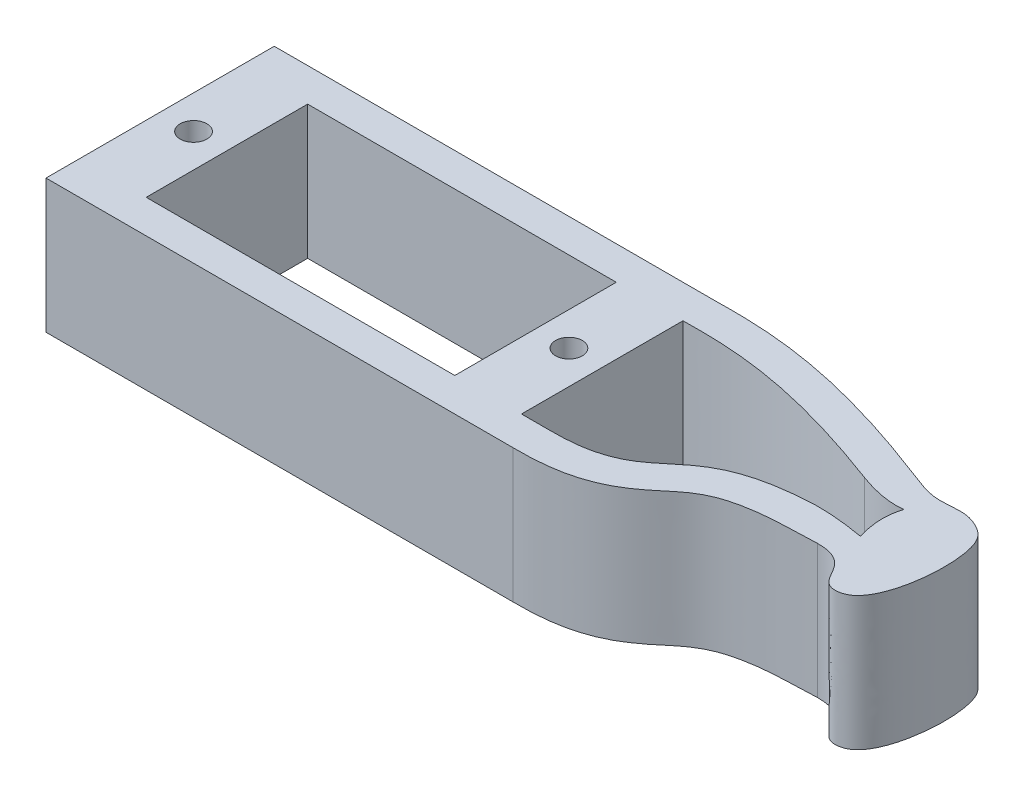
ISO-10303-21;
HEADER;
FILE_DESCRIPTION(('STEP AP214'),'2;1');
FILE_NAME('part.step','',(''),(''),'','','');
FILE_SCHEMA(('AUTOMOTIVE_DESIGN { 1 0 10303 214 1 1 1 1 }'));
ENDSEC;
DATA;
#1=APPLICATION_CONTEXT('core data for automotive mechanical design processes');
#2=APPLICATION_PROTOCOL_DEFINITION('international standard','automotive_design',2000,#1);
#3=PRODUCT_CONTEXT('',#1,'mechanical');
#4=PRODUCT('Part','Part','',(#3));
#5=PRODUCT_RELATED_PRODUCT_CATEGORY('part','',(#4));
#6=PRODUCT_DEFINITION_FORMATION('','',#4);
#7=PRODUCT_DEFINITION_CONTEXT('part definition',#1,'design');
#8=PRODUCT_DEFINITION('design','',#6,#7);
#9=PRODUCT_DEFINITION_SHAPE('','',#8);
#10=(LENGTH_UNIT() NAMED_UNIT(*) SI_UNIT(.MILLI.,.METRE.));
#11=(NAMED_UNIT(*) PLANE_ANGLE_UNIT() SI_UNIT($,.RADIAN.));
#12=(NAMED_UNIT(*) SI_UNIT($,.STERADIAN.) SOLID_ANGLE_UNIT());
#13=UNCERTAINTY_MEASURE_WITH_UNIT(LENGTH_MEASURE(1.E-05),#10,'distance_accuracy_value','');
#14=(GEOMETRIC_REPRESENTATION_CONTEXT(3) GLOBAL_UNCERTAINTY_ASSIGNED_CONTEXT((#13)) GLOBAL_UNIT_ASSIGNED_CONTEXT((#10,
#11,#12)) REPRESENTATION_CONTEXT('',''));
#15=CARTESIAN_POINT('',(0.,0.,0.));
#16=DIRECTION('',(0.,0.,1.));
#17=DIRECTION('',(1.,0.,0.));
#18=AXIS2_PLACEMENT_3D('',#15,#16,#17);
#19=CARTESIAN_POINT('',(38.866856063161,10.,11.3671407197963));
#20=DIRECTION('',(0.,1.,0.));
#21=DIRECTION('',(0.,0.,1.));
#22=AXIS2_PLACEMENT_3D('',#19,#20,#21);
#23=PLANE('',#22);
#24=CARTESIAN_POINT('',(-2.5,10.,6.04258256770856));
#25=DIRECTION('',(0.,1.,0.));
#26=DIRECTION('',(0.,0.,1.));
#27=AXIS2_PLACEMENT_3D('',#24,#25,#26);
#28=CIRCLE('',#27,1.);
#29=CARTESIAN_POINT('',(-2.5,10.,7.04258256770856));
#30=VERTEX_POINT('',#29);
#31=EDGE_CURVE('E608',#30,#30,#28,.T.);
#32=ORIENTED_EDGE('',*,*,#31,.F.);
#33=EDGE_LOOP('',(#32));
#34=FACE_BOUND('',#33,.T.);
#35=DIRECTION('',(-1.,0.,0.));
#36=VECTOR('',#35,1.);
#37=CARTESIAN_POINT('',(-2.5,10.,-2.5));
#38=LINE('',#37,#36);
#39=CARTESIAN_POINT('',(28.070995288117,10.,-2.5));
#40=VERTEX_POINT('',#39);
#41=CARTESIAN_POINT('',(-5.,10.,-2.5));
#42=VERTEX_POINT('',#41);
#43=EDGE_CURVE('E303',#40,#42,#38,.T.);
#44=ORIENTED_EDGE('',*,*,#43,.T.);
#45=DIRECTION('',(0.,0.,1.));
#46=VECTOR('',#45,1.);
#47=CARTESIAN_POINT('',(-5.,10.,-2.5));
#48=LINE('',#47,#46);
#49=CARTESIAN_POINT('',(-5.,10.,14.5851651354171));
#50=VERTEX_POINT('',#49);
#51=EDGE_CURVE('E329',#42,#50,#48,.T.);
#52=ORIENTED_EDGE('',*,*,#51,.T.);
#53=DIRECTION('',(1.,0.,0.));
#54=VECTOR('',#53,1.);
#55=CARTESIAN_POINT('',(-5.,10.,14.5851651354171));
#56=LINE('',#55,#54);
#57=CARTESIAN_POINT('',(29.9653226309514,10.,14.5851651354171));
#58=VERTEX_POINT('',#57);
#59=EDGE_CURVE('E327',#50,#58,#56,.T.);
#60=ORIENTED_EDGE('',*,*,#59,.T.);
#61=CARTESIAN_POINT('',(29.9653226309514,10.,14.5851651354171));
#62=CARTESIAN_POINT('',(30.2668833563867,10.,14.5898357500036));
#63=CARTESIAN_POINT('',(30.8847993932556,10.,14.5871634127323));
#64=CARTESIAN_POINT('',(32.0030622844559,10.,14.5316925353354));
#65=CARTESIAN_POINT('',(33.2811269243152,10.,14.370482550396));
#66=CARTESIAN_POINT('',(34.6306273579348,10.,14.0302012832418));
#67=CARTESIAN_POINT('',(36.2077787560436,10.,13.3956332601621));
#68=CARTESIAN_POINT('',(37.7107836885223,10.,12.3641523123226));
#69=CARTESIAN_POINT('',(38.9005842184664,10.,11.3107949181522));
#70=CARTESIAN_POINT('',(39.8880158165781,10.,10.5955123338464));
#71=CARTESIAN_POINT('',(40.9997202200975,10.,10.0913370400385));
#72=CARTESIAN_POINT('',(42.3958211156878,10.,9.74989797390779));
#73=CARTESIAN_POINT('',(43.5205567033827,10.,9.58887360688736));
#74=CARTESIAN_POINT('',(44.475367740813,10.,9.51415898751658));
#75=CARTESIAN_POINT('',(45.0509948291004,10.,9.48549730480388));
#76=CARTESIAN_POINT('',(45.7237401045998,10.,9.46123199927853));
#77=CARTESIAN_POINT('',(46.555372490214,10.,9.42886966982337));
#78=CARTESIAN_POINT('',(47.2235124432799,10.,9.40359868551212));
#79=CARTESIAN_POINT('',(47.557228164241,10.,9.39088583344988));
#80=B_SPLINE_CURVE_WITH_KNOTS('',3,(#61,#62,#63,#64,#65,#66,#67,#68,#69,#70,#71,#72,#73,#74,#75,
#76,#77,#78,#79),.UNSPECIFIED.,.F.,.F.,(4,1,1,1,1,1,1,1,1,1,1,1,1,1,1,1,4),
(0.000757075448015065,0.0345176505249425,0.0682782256018699,0.135799375755725,0.20332052590958,
0.270841676063435,0.405883976371145,0.540926276678854,0.675968576986564,0.811010877294274,
0.878532027448129,0.946053177601984,0.979813752678911,0.996694040217375,1.01357432775584,
1.04733490283277,1.08109547790969),.UNSPECIFIED.);
#81=CARTESIAN_POINT('',(47.557228164241,10.,9.39088583344988));
#82=VERTEX_POINT('',#81);
#83=EDGE_CURVE('E349',#58,#82,#80,.T.);
#84=ORIENTED_EDGE('',*,*,#83,.T.);
#85=CARTESIAN_POINT('',(47.557228164241,10.,9.39088583344988));
#86=CARTESIAN_POINT('',(50.2446120958962,10.,9.35727304528843));
#87=CARTESIAN_POINT('',(49.6149107489341,10.,12.0219621910214));
#88=CARTESIAN_POINT('',(53.8106331794863,10.,11.5109371008119));
#89=CARTESIAN_POINT('',(54.3502018436602,10.,3.71524579387331));
#90=CARTESIAN_POINT('',(50.7905552456439,10.,1.17583070517761));
#91=CARTESIAN_POINT('',(49.8399959501129,10.,2.57848633737034));
#92=CARTESIAN_POINT('',(47.557228164241,10.,1.6341251114046));
#93=B_SPLINE_CURVE_WITH_KNOTS('',3,(#85,#86,#87,#88,#89,#90,#91,#92),.UNSPECIFIED.,.F.,.F.,(4,1,
1,1,1,4),(0.,0.206124452316591,0.260502327976179,0.512303597860358,0.589400880936293,1.),.UNSPECIFIED.);
#94=CARTESIAN_POINT('',(47.557228164241,10.,1.6341251114046));
#95=VERTEX_POINT('',#94);
#96=EDGE_CURVE('E260',#82,#95,#93,.T.);
#97=ORIENTED_EDGE('',*,*,#96,.T.);
#98=CARTESIAN_POINT('',(47.557228164241,10.,1.6341251114046));
#99=CARTESIAN_POINT('',(46.3856638823738,10.,1.19574857386112));
#100=CARTESIAN_POINT('',(43.9533969383482,10.,0.279779405527691));
#101=CARTESIAN_POINT('',(40.7938756495151,10.,-0.734966306684224));
#102=CARTESIAN_POINT('',(37.9973626381524,10.,-1.48587386732508));
#103=CARTESIAN_POINT('',(34.7071159792565,10.,-2.16873147415008));
#104=CARTESIAN_POINT('',(31.9642252839365,10.,-2.45751719053389));
#105=CARTESIAN_POINT('',(29.9218666157721,10.,-2.51211922864548));
#106=CARTESIAN_POINT('',(28.8355626574832,10.,-2.51124596502211));
#107=CARTESIAN_POINT('',(28.3288734396236,10.,-2.50431808469216));
#108=CARTESIAN_POINT('',(28.070995288117,10.,-2.5));
#109=B_SPLINE_CURVE_WITH_KNOTS('',3,(#98,#99,#100,#101,#102,#103,#104,#105,#106,#107,#108),
.UNSPECIFIED.,.F.,.F.,(4,1,1,1,1,1,1,1,4),(0.143669129094372,0.257224140802001,0.37077915250963,
0.484334164217259,0.597889175924887,0.824999199340145,0.938554211047774,0.995331716901588,
1.0521092227554),.UNSPECIFIED.);
#110=EDGE_CURVE('E252',#95,#40,#109,.T.);
#111=ORIENTED_EDGE('',*,*,#110,.T.);
#112=EDGE_LOOP('',(#44,#52,#60,#84,#97,#111));
#113=FACE_BOUND('',#112,.T.);
#114=DIRECTION('',(0.,0.,1.));
#115=VECTOR('',#114,1.);
#116=CARTESIAN_POINT('',(0.,10.,0.));
#117=LINE('',#116,#115);
#118=CARTESIAN_POINT('',(0.,10.,0.));
#119=VERTEX_POINT('',#118);
#120=CARTESIAN_POINT('',(0.,10.,12.0851651354171));
#121=VERTEX_POINT('',#120);
#122=EDGE_CURVE('E669',#119,#121,#117,.T.);
#123=ORIENTED_EDGE('',*,*,#122,.F.);
#124=DIRECTION('',(-1.,0.,0.));
#125=VECTOR('',#124,1.);
#126=CARTESIAN_POINT('',(0.,10.,0.));
#127=LINE('',#126,#125);
#128=CARTESIAN_POINT('',(23.1,10.,0.));
#129=VERTEX_POINT('',#128);
#130=EDGE_CURVE('E666',#129,#119,#127,.T.);
#131=ORIENTED_EDGE('',*,*,#130,.F.);
#132=DIRECTION('',(0.,0.,-1.));
#133=VECTOR('',#132,1.);
#134=CARTESIAN_POINT('',(23.1,10.,12.0851651354171));
#135=LINE('',#134,#133);
#136=CARTESIAN_POINT('',(23.1,10.,12.0851651354171));
#137=VERTEX_POINT('',#136);
#138=EDGE_CURVE('E677',#137,#129,#135,.T.);
#139=ORIENTED_EDGE('',*,*,#138,.F.);
#140=DIRECTION('',(1.,0.,0.));
#141=VECTOR('',#140,1.);
#142=CARTESIAN_POINT('',(0.,10.,12.0851651354171));
#143=LINE('',#142,#141);
#144=EDGE_CURVE('E673',#121,#137,#143,.T.);
#145=ORIENTED_EDGE('',*,*,#144,.F.);
#146=EDGE_LOOP('',(#123,#131,#139,#145));
#147=FACE_BOUND('',#146,.T.);
#148=CARTESIAN_POINT('',(45.057228164241,10.,6.98430960657603));
#149=CARTESIAN_POINT('',(46.596168679815,10.,6.96066102325324));
#150=CARTESIAN_POINT('',(48.7103270151303,10.,7.32576645158645));
#151=B_SPLINE_CURVE_WITH_KNOTS('',2,(#148,#149,#150),.UNSPECIFIED.,.F.,.F.,(3,3),(0.,1.),.UNSPECIFIED.);
#152=CARTESIAN_POINT('',(45.057228164241,10.,6.98430960657603));
#153=VERTEX_POINT('',#152);
#154=CARTESIAN_POINT('',(48.7103270151303,10.,7.32576645158645));
#155=VERTEX_POINT('',#154);
#156=EDGE_CURVE('E172',#153,#155,#151,.T.);
#157=ORIENTED_EDGE('',*,*,#156,.F.);
#158=CARTESIAN_POINT('',(29.9852161632243,10.,12.0851651354171));
#159=CARTESIAN_POINT('',(38.2810747079521,10.,12.2209443605822));
#160=CARTESIAN_POINT('',(35.1724522029101,10.,7.36086871533734));
#161=CARTESIAN_POINT('',(45.057228164241,10.,6.98430960657603));
#162=B_SPLINE_CURVE_WITH_KNOTS('',3,(#158,#159,#160,#161),.UNSPECIFIED.,.F.,.F.,(4,4),(0.,1.),.UNSPECIFIED.);
#163=CARTESIAN_POINT('',(29.9852161632243,10.,12.0851651354171));
#164=VERTEX_POINT('',#163);
#165=EDGE_CURVE('E163',#164,#153,#162,.T.);
#166=ORIENTED_EDGE('',*,*,#165,.F.);
#167=DIRECTION('',(1.,0.,0.));
#168=VECTOR('',#167,1.);
#169=CARTESIAN_POINT('',(28.0920322760738,10.,12.0851651354171));
#170=LINE('',#169,#168);
#171=CARTESIAN_POINT('',(28.0920322760738,10.,12.0851651354171));
#172=VERTEX_POINT('',#171);
#173=EDGE_CURVE('E601',#172,#164,#170,.T.);
#174=ORIENTED_EDGE('',*,*,#173,.F.);
#175=DIRECTION('',(0.,0.,1.));
#176=VECTOR('',#175,1.);
#177=CARTESIAN_POINT('',(28.0920322760738,10.,0.));
#178=LINE('',#177,#176);
#179=CARTESIAN_POINT('',(28.0920322760738,10.,0.));
#180=VERTEX_POINT('',#179);
#181=EDGE_CURVE('E592',#180,#172,#178,.T.);
#182=ORIENTED_EDGE('',*,*,#181,.F.);
#183=CARTESIAN_POINT('',(45.0572281642411,10.,3.36795631708854));
#184=CARTESIAN_POINT('',(36.1453920604466,10.,0.0333208089882172));
#185=CARTESIAN_POINT('',(31.8190342239397,10.,-0.0630491739583388));
#186=CARTESIAN_POINT('',(28.0920322760738,10.,0.));
#187=B_SPLINE_CURVE_WITH_KNOTS('',3,(#183,#184,#185,#186),.UNSPECIFIED.,.F.,.F.,(4,4),
(0.142072163734168,1.),.UNSPECIFIED.);
#188=CARTESIAN_POINT('',(45.0572281642411,10.,3.36795631708854));
#189=VERTEX_POINT('',#188);
#190=EDGE_CURVE('E587',#189,#180,#187,.T.);
#191=ORIENTED_EDGE('',*,*,#190,.F.);
#192=CARTESIAN_POINT('',(48.5973126252053,10.,3.96311649777559));
#193=CARTESIAN_POINT('',(47.1810751517544,10.,4.141830425743));
#194=CARTESIAN_POINT('',(45.057228164241,10.,3.36795631708853));
#195=B_SPLINE_CURVE_WITH_KNOTS('',2,(#192,#193,#194),.UNSPECIFIED.,.F.,.F.,(3,3),(0.,1.),.UNSPECIFIED.);
#196=CARTESIAN_POINT('',(48.5973126252053,10.,3.96311649777559));
#197=VERTEX_POINT('',#196);
#198=EDGE_CURVE('E193',#197,#189,#195,.T.);
#199=ORIENTED_EDGE('',*,*,#198,.F.);
#200=CARTESIAN_POINT('',(48.7103270151303,10.,7.32576645158645));
#201=CARTESIAN_POINT('',(48.3452536132831,10.,6.19757171358135));
#202=CARTESIAN_POINT('',(48.2430866216302,10.,5.00954180630637));
#203=CARTESIAN_POINT('',(48.5973126252053,10.,3.96311649777559));
#204=B_SPLINE_CURVE_WITH_KNOTS('',3,(#200,#201,#202,#203),.UNSPECIFIED.,.F.,.F.,(4,4),(0.,1.),.UNSPECIFIED.);
#205=EDGE_CURVE('E187',#155,#197,#204,.T.);
#206=ORIENTED_EDGE('',*,*,#205,.F.);
#207=EDGE_LOOP('',(#157,#166,#174,#182,#191,#199,#206));
#208=FACE_BOUND('',#207,.T.);
#209=CARTESIAN_POINT('',(25.6000010172625,10.,6.04254892676587));
#210=DIRECTION('',(0.,1.,0.));
#211=DIRECTION('',(0.,0.,1.));
#212=AXIS2_PLACEMENT_3D('',#209,#210,#211);
#213=CIRCLE('',#212,1.);
#214=CARTESIAN_POINT('',(25.6000010172625,10.,7.04254892676587));
#215=VERTEX_POINT('',#214);
#216=EDGE_CURVE('E720',#215,#215,#213,.T.);
#217=ORIENTED_EDGE('',*,*,#216,.F.);
#218=EDGE_LOOP('',(#217));
#219=FACE_BOUND('',#218,.T.);
#220=ADVANCED_FACE('F43',(#34,#113,#147,#208,#219),#23,.T.);
#221=CARTESIAN_POINT('',(38.866856063161,0.,11.3671407197963));
#222=DIRECTION('',(0.,1.,0.));
#223=DIRECTION('',(0.,0.,1.));
#224=AXIS2_PLACEMENT_3D('',#221,#222,#223);
#225=PLANE('',#224);
#226=DIRECTION('',(-1.,0.,0.));
#227=VECTOR('',#226,1.);
#228=CARTESIAN_POINT('',(0.,0.,0.));
#229=LINE('',#228,#227);
#230=CARTESIAN_POINT('',(23.1,0.,0.));
#231=VERTEX_POINT('',#230);
#232=CARTESIAN_POINT('',(0.,0.,0.));
#233=VERTEX_POINT('',#232);
#234=EDGE_CURVE('E181',#231,#233,#229,.T.);
#235=ORIENTED_EDGE('',*,*,#234,.T.);
#236=DIRECTION('',(0.,0.,1.));
#237=VECTOR('',#236,1.);
#238=CARTESIAN_POINT('',(0.,0.,0.));
#239=LINE('',#238,#237);
#240=CARTESIAN_POINT('',(0.,0.,12.0851651354171));
#241=VERTEX_POINT('',#240);
#242=EDGE_CURVE('E684',#233,#241,#239,.T.);
#243=ORIENTED_EDGE('',*,*,#242,.T.);
#244=DIRECTION('',(1.,0.,0.));
#245=VECTOR('',#244,1.);
#246=CARTESIAN_POINT('',(0.,0.,12.0851651354171));
#247=LINE('',#246,#245);
#248=CARTESIAN_POINT('',(23.1,0.,12.0851651354171));
#249=VERTEX_POINT('',#248);
#250=EDGE_CURVE('E688',#241,#249,#247,.T.);
#251=ORIENTED_EDGE('',*,*,#250,.T.);
#252=DIRECTION('',(0.,0.,-1.));
#253=VECTOR('',#252,1.);
#254=CARTESIAN_POINT('',(23.1,0.,12.0851651354171));
#255=LINE('',#254,#253);
#256=EDGE_CURVE('E670',#249,#231,#255,.T.);
#257=ORIENTED_EDGE('',*,*,#256,.T.);
#258=EDGE_LOOP('',(#235,#243,#251,#257));
#259=FACE_BOUND('',#258,.T.);
#260=DIRECTION('',(0.,0.,1.));
#261=VECTOR('',#260,1.);
#262=CARTESIAN_POINT('',(-5.,0.,-2.5));
#263=LINE('',#262,#261);
#264=CARTESIAN_POINT('',(-5.,0.,-2.5));
#265=VERTEX_POINT('',#264);
#266=CARTESIAN_POINT('',(-5.,0.,14.5851651354171));
#267=VERTEX_POINT('',#266);
#268=EDGE_CURVE('E265',#265,#267,#263,.T.);
#269=ORIENTED_EDGE('',*,*,#268,.F.);
#270=DIRECTION('',(-1.,0.,0.));
#271=VECTOR('',#270,1.);
#272=CARTESIAN_POINT('',(-2.5,0.,-2.5));
#273=LINE('',#272,#271);
#274=CARTESIAN_POINT('',(28.070995288117,0.,-2.5));
#275=VERTEX_POINT('',#274);
#276=EDGE_CURVE('E297',#275,#265,#273,.T.);
#277=ORIENTED_EDGE('',*,*,#276,.F.);
#278=CARTESIAN_POINT('',(47.557228164241,0.,1.6341251114046));
#279=CARTESIAN_POINT('',(46.3856638823738,0.,1.19574857386112));
#280=CARTESIAN_POINT('',(43.9533969383482,0.,0.279779405527691));
#281=CARTESIAN_POINT('',(40.7938756495151,0.,-0.734966306684224));
#282=CARTESIAN_POINT('',(37.9973626381524,0.,-1.48587386732508));
#283=CARTESIAN_POINT('',(34.7071159792565,0.,-2.16873147415008));
#284=CARTESIAN_POINT('',(31.9642252839365,0.,-2.45751719053389));
#285=CARTESIAN_POINT('',(29.9218666157721,0.,-2.51211922864548));
#286=CARTESIAN_POINT('',(28.8355626574832,0.,-2.51124596502211));
#287=CARTESIAN_POINT('',(28.3288734396236,0.,-2.50431808469216));
#288=CARTESIAN_POINT('',(28.070995288117,0.,-2.5));
#289=B_SPLINE_CURVE_WITH_KNOTS('',3,(#278,#279,#280,#281,#282,#283,#284,#285,#286,#287,#288),
.UNSPECIFIED.,.F.,.F.,(4,1,1,1,1,1,1,1,4),(0.143669129094372,0.257224140802001,0.37077915250963,
0.484334164217259,0.597889175924887,0.824999199340145,0.938554211047774,0.995331716901588,
1.0521092227554),.UNSPECIFIED.);
#290=CARTESIAN_POINT('',(47.557228164241,0.,1.6341251114046));
#291=VERTEX_POINT('',#290);
#292=EDGE_CURVE('E289',#291,#275,#289,.T.);
#293=ORIENTED_EDGE('',*,*,#292,.F.);
#294=CARTESIAN_POINT('',(47.557228164241,0.,9.39088583344988));
#295=CARTESIAN_POINT('',(50.2446120958962,0.,9.35727304528843));
#296=CARTESIAN_POINT('',(49.6149107489341,0.,12.0219621910214));
#297=CARTESIAN_POINT('',(53.8106331794863,0.,11.5109371008119));
#298=CARTESIAN_POINT('',(54.3502018436602,0.,3.71524579387331));
#299=CARTESIAN_POINT('',(50.7905552456439,0.,1.17583070517761));
#300=CARTESIAN_POINT('',(49.8399959501129,0.,2.57848633737034));
#301=CARTESIAN_POINT('',(47.557228164241,0.,1.6341251114046));
#302=B_SPLINE_CURVE_WITH_KNOTS('',3,(#294,#295,#296,#297,#298,#299,#300,#301),.UNSPECIFIED.,.F.,
.F.,(4,1,1,1,1,4),(0.,0.206124452316591,0.260502327976179,0.512303597860358,0.589400880936293,
1.),.UNSPECIFIED.);
#303=CARTESIAN_POINT('',(47.557228164241,0.,9.39088583344988));
#304=VERTEX_POINT('',#303);
#305=EDGE_CURVE('E281',#304,#291,#302,.T.);
#306=ORIENTED_EDGE('',*,*,#305,.F.);
#307=CARTESIAN_POINT('',(29.9653226309514,0.,14.5851651354171));
#308=CARTESIAN_POINT('',(30.2668833563867,0.,14.5898357500036));
#309=CARTESIAN_POINT('',(30.8847993932556,0.,14.5871634127323));
#310=CARTESIAN_POINT('',(32.0030622844559,0.,14.5316925353354));
#311=CARTESIAN_POINT('',(33.2811269243152,0.,14.370482550396));
#312=CARTESIAN_POINT('',(34.6306273579348,0.,14.0302012832418));
#313=CARTESIAN_POINT('',(36.2077787560436,0.,13.3956332601621));
#314=CARTESIAN_POINT('',(37.7107836885223,0.,12.3641523123226));
#315=CARTESIAN_POINT('',(38.9005842184664,0.,11.3107949181522));
#316=CARTESIAN_POINT('',(39.8880158165781,0.,10.5955123338464));
#317=CARTESIAN_POINT('',(40.9997202200975,0.,10.0913370400385));
#318=CARTESIAN_POINT('',(42.3958211156878,0.,9.74989797390779));
#319=CARTESIAN_POINT('',(43.5205567033827,0.,9.58887360688736));
#320=CARTESIAN_POINT('',(44.475367740813,0.,9.51415898751658));
#321=CARTESIAN_POINT('',(45.0509948291004,0.,9.48549730480388));
#322=CARTESIAN_POINT('',(45.7237401045998,0.,9.46123199927853));
#323=CARTESIAN_POINT('',(46.555372490214,0.,9.42886966982337));
#324=CARTESIAN_POINT('',(47.2235124432799,0.,9.40359868551212));
#325=CARTESIAN_POINT('',(47.557228164241,0.,9.39088583344988));
#326=B_SPLINE_CURVE_WITH_KNOTS('',3,(#307,#308,#309,#310,#311,#312,#313,#314,#315,#316,#317,
#318,#319,#320,#321,#322,#323,#324,#325),.UNSPECIFIED.,.F.,.F.,(4,1,1,1,1,1,1,1,1,1,1,1,1,1,1,1,
4),(0.000757075448015065,0.0345176505249425,0.0682782256018699,0.135799375755725,
0.20332052590958,0.270841676063435,0.405883976371145,0.540926276678854,0.675968576986564,
0.811010877294274,0.878532027448129,0.946053177601984,0.979813752678911,0.996694040217375,
1.01357432775584,1.04733490283277,1.08109547790969),.UNSPECIFIED.);
#327=CARTESIAN_POINT('',(29.9653226309514,0.,14.5851651354171));
#328=VERTEX_POINT('',#327);
#329=EDGE_CURVE('E276',#328,#304,#326,.T.);
#330=ORIENTED_EDGE('',*,*,#329,.F.);
#331=DIRECTION('',(1.,0.,0.));
#332=VECTOR('',#331,1.);
#333=CARTESIAN_POINT('',(-2.5,0.,14.5851651354171));
#334=LINE('',#333,#332);
#335=EDGE_CURVE('E272',#267,#328,#334,.T.);
#336=ORIENTED_EDGE('',*,*,#335,.F.);
#337=EDGE_LOOP('',(#269,#277,#293,#306,#330,#336));
#338=FACE_BOUND('',#337,.T.);
#339=CARTESIAN_POINT('',(29.9852161632243,0.,12.0851651354171));
#340=CARTESIAN_POINT('',(38.2810747079521,0.,12.2209443605822));
#341=CARTESIAN_POINT('',(35.1724522029101,0.,7.36086871533734));
#342=CARTESIAN_POINT('',(45.057228164241,0.,6.98430960657603));
#343=B_SPLINE_CURVE_WITH_KNOTS('',3,(#339,#340,#341,#342),.UNSPECIFIED.,.F.,.F.,(4,4),(0.,1.),.UNSPECIFIED.);
#344=CARTESIAN_POINT('',(29.9852161632243,0.,12.0851651354171));
#345=VERTEX_POINT('',#344);
#346=CARTESIAN_POINT('',(45.057228164241,0.,6.98430960657603));
#347=VERTEX_POINT('',#346);
#348=EDGE_CURVE('E67',#345,#347,#343,.T.);
#349=ORIENTED_EDGE('',*,*,#348,.T.);
#350=CARTESIAN_POINT('',(45.057228164241,0.,6.98430960657603));
#351=CARTESIAN_POINT('',(46.596168679815,0.,6.96066102325324));
#352=CARTESIAN_POINT('',(48.7103270151303,0.,7.32576645158645));
#353=B_SPLINE_CURVE_WITH_KNOTS('',2,(#350,#351,#352),.UNSPECIFIED.,.F.,.F.,(3,3),(0.,1.),.UNSPECIFIED.);
#354=CARTESIAN_POINT('',(48.7103270151303,0.,7.32576645158645));
#355=VERTEX_POINT('',#354);
#356=EDGE_CURVE('E179',#347,#355,#353,.T.);
#357=ORIENTED_EDGE('',*,*,#356,.T.);
#358=CARTESIAN_POINT('',(48.7103270151303,0.,7.32576645158645));
#359=CARTESIAN_POINT('',(48.3452536132831,0.,6.19757171358135));
#360=CARTESIAN_POINT('',(48.2430866216302,0.,5.00954180630637));
#361=CARTESIAN_POINT('',(48.5973126252053,0.,3.96311649777559));
#362=B_SPLINE_CURVE_WITH_KNOTS('',3,(#358,#359,#360,#361),.UNSPECIFIED.,.F.,.F.,(4,4),(0.,1.),.UNSPECIFIED.);
#363=CARTESIAN_POINT('',(48.5973126252053,0.,3.96311649777559));
#364=VERTEX_POINT('',#363);
#365=EDGE_CURVE('E616',#355,#364,#362,.T.);
#366=ORIENTED_EDGE('',*,*,#365,.T.);
#367=CARTESIAN_POINT('',(48.5973126252053,0.,3.96311649777559));
#368=CARTESIAN_POINT('',(47.1810751517544,0.,4.141830425743));
#369=CARTESIAN_POINT('',(45.057228164241,0.,3.36795631708853));
#370=B_SPLINE_CURVE_WITH_KNOTS('',2,(#367,#368,#369),.UNSPECIFIED.,.F.,.F.,(3,3),(0.,1.),.UNSPECIFIED.);
#371=CARTESIAN_POINT('',(45.0572281642411,0.,3.36795631708854));
#372=VERTEX_POINT('',#371);
#373=EDGE_CURVE('E625',#364,#372,#370,.T.);
#374=ORIENTED_EDGE('',*,*,#373,.T.);
#375=CARTESIAN_POINT('',(45.0572281642411,0.,3.36795631708854));
#376=CARTESIAN_POINT('',(36.1453920604466,0.,0.0333208089882172));
#377=CARTESIAN_POINT('',(31.8190342239397,0.,-0.0630491739583388));
#378=CARTESIAN_POINT('',(28.0920322760738,0.,0.));
#379=B_SPLINE_CURVE_WITH_KNOTS('',3,(#375,#376,#377,#378),.UNSPECIFIED.,.F.,.F.,(4,4),
(0.142072163734168,1.),.UNSPECIFIED.);
#380=CARTESIAN_POINT('',(28.0920322760738,0.,0.));
#381=VERTEX_POINT('',#380);
#382=EDGE_CURVE('E633',#372,#381,#379,.T.);
#383=ORIENTED_EDGE('',*,*,#382,.T.);
#384=DIRECTION('',(0.,0.,1.));
#385=VECTOR('',#384,1.);
#386=CARTESIAN_POINT('',(28.0920322760738,0.,0.));
#387=LINE('',#386,#385);
#388=CARTESIAN_POINT('',(28.0920322760738,0.,12.0851651354171));
#389=VERTEX_POINT('',#388);
#390=EDGE_CURVE('E642',#381,#389,#387,.T.);
#391=ORIENTED_EDGE('',*,*,#390,.T.);
#392=DIRECTION('',(1.,0.,0.));
#393=VECTOR('',#392,1.);
#394=CARTESIAN_POINT('',(28.0920322760738,0.,12.0851651354171));
#395=LINE('',#394,#393);
#396=EDGE_CURVE('E173',#389,#345,#395,.T.);
#397=ORIENTED_EDGE('',*,*,#396,.T.);
#398=EDGE_LOOP('',(#349,#357,#366,#374,#383,#391,#397));
#399=FACE_BOUND('',#398,.T.);
#400=CARTESIAN_POINT('',(-2.5,0.,6.04258256770856));
#401=DIRECTION('',(0.,1.,0.));
#402=DIRECTION('',(0.,0.,1.));
#403=AXIS2_PLACEMENT_3D('',#400,#401,#402);
#404=CIRCLE('',#403,1.);
#405=CARTESIAN_POINT('',(-2.5,0.,7.04258256770856));
#406=VERTEX_POINT('',#405);
#407=EDGE_CURVE('E721',#406,#406,#404,.T.);
#408=ORIENTED_EDGE('',*,*,#407,.T.);
#409=EDGE_LOOP('',(#408));
#410=FACE_BOUND('',#409,.T.);
#411=CARTESIAN_POINT('',(25.6000010172625,0.,6.04254892676587));
#412=DIRECTION('',(0.,1.,0.));
#413=DIRECTION('',(0.,0.,1.));
#414=AXIS2_PLACEMENT_3D('',#411,#412,#413);
#415=CIRCLE('',#414,1.);
#416=CARTESIAN_POINT('',(25.6000010172625,0.,7.04254892676587));
#417=VERTEX_POINT('',#416);
#418=EDGE_CURVE('E722',#417,#417,#415,.T.);
#419=ORIENTED_EDGE('',*,*,#418,.T.);
#420=EDGE_LOOP('',(#419));
#421=FACE_BOUND('',#420,.T.);
#422=ADVANCED_FACE('F236',(#259,#338,#399,#410,#421),#225,.F.);
#423=CARTESIAN_POINT('',(-5.,10.,-2.5));
#424=DIRECTION('',(1.,0.,0.));
#425=DIRECTION('',(0.,0.,-1.));
#426=AXIS2_PLACEMENT_3D('',#423,#424,#425);
#427=PLANE('',#426);
#428=ORIENTED_EDGE('',*,*,#268,.T.);
#429=DIRECTION('',(0.,-1.,0.));
#430=VECTOR('',#429,1.);
#431=CARTESIAN_POINT('',(-5.,10.,14.5851651354171));
#432=LINE('',#431,#430);
#433=EDGE_CURVE('E52',#50,#267,#432,.T.);
#434=ORIENTED_EDGE('',*,*,#433,.F.);
#435=ORIENTED_EDGE('',*,*,#51,.F.);
#436=DIRECTION('',(0.,-1.,0.));
#437=VECTOR('',#436,1.);
#438=CARTESIAN_POINT('',(-5.,10.,-2.5));
#439=LINE('',#438,#437);
#440=EDGE_CURVE('E11',#42,#265,#439,.T.);
#441=ORIENTED_EDGE('',*,*,#440,.T.);
#442=EDGE_LOOP('',(#428,#434,#435,#441));
#443=FACE_BOUND('',#442,.T.);
#444=ADVANCED_FACE('F45',(#443),#427,.F.);
#445=CARTESIAN_POINT('',(-2.5,10.,14.5851651354171));
#446=DIRECTION('',(0.,0.,-1.));
#447=DIRECTION('',(-1.,0.,0.));
#448=AXIS2_PLACEMENT_3D('',#445,#446,#447);
#449=PLANE('',#448);
#450=ORIENTED_EDGE('',*,*,#335,.T.);
#451=DIRECTION('',(0.,-1.,0.));
#452=VECTOR('',#451,1.);
#453=CARTESIAN_POINT('',(29.9653226309514,10.,14.5851651354171));
#454=LINE('',#453,#452);
#455=EDGE_CURVE('E315',#58,#328,#454,.T.);
#456=ORIENTED_EDGE('',*,*,#455,.F.);
#457=ORIENTED_EDGE('',*,*,#59,.F.);
#458=ORIENTED_EDGE('',*,*,#433,.T.);
#459=EDGE_LOOP('',(#450,#456,#457,#458));
#460=FACE_BOUND('',#459,.T.);
#461=ADVANCED_FACE('F325',(#460),#449,.F.);
#462=DIRECTION('',(0.,-1.,0.));
#463=VECTOR('',#462,1.);
#464=SURFACE_OF_LINEAR_EXTRUSION('',#80,#463);
#465=ORIENTED_EDGE('',*,*,#329,.T.);
#466=DIRECTION('',(0.,-1.,0.));
#467=VECTOR('',#466,1.);
#468=CARTESIAN_POINT('',(47.557228164241,10.,9.39088583344988));
#469=LINE('',#468,#467);
#470=EDGE_CURVE('E311',#82,#304,#469,.T.);
#471=ORIENTED_EDGE('',*,*,#470,.F.);
#472=ORIENTED_EDGE('',*,*,#83,.F.);
#473=ORIENTED_EDGE('',*,*,#455,.T.);
#474=EDGE_LOOP('',(#465,#471,#472,#473));
#475=FACE_BOUND('',#474,.T.);
#476=ADVANCED_FACE('F341',(#475),#464,.F.);
#477=DIRECTION('',(0.,-1.,0.));
#478=VECTOR('',#477,1.);
#479=SURFACE_OF_LINEAR_EXTRUSION('',#93,#478);
#480=ORIENTED_EDGE('',*,*,#305,.T.);
#481=DIRECTION('',(0.,-1.,0.));
#482=VECTOR('',#481,1.);
#483=CARTESIAN_POINT('',(47.557228164241,10.,1.6341251114046));
#484=LINE('',#483,#482);
#485=EDGE_CURVE('E307',#95,#291,#484,.T.);
#486=ORIENTED_EDGE('',*,*,#485,.F.);
#487=ORIENTED_EDGE('',*,*,#96,.F.);
#488=ORIENTED_EDGE('',*,*,#470,.T.);
#489=EDGE_LOOP('',(#480,#486,#487,#488));
#490=FACE_BOUND('',#489,.T.);
#491=ADVANCED_FACE('F248',(#490),#479,.F.);
#492=DIRECTION('',(0.,-1.,0.));
#493=VECTOR('',#492,1.);
#494=SURFACE_OF_LINEAR_EXTRUSION('',#109,#493);
#495=ORIENTED_EDGE('',*,*,#292,.T.);
#496=DIRECTION('',(0.,-1.,0.));
#497=VECTOR('',#496,1.);
#498=CARTESIAN_POINT('',(28.070995288117,10.,-2.5));
#499=LINE('',#498,#497);
#500=EDGE_CURVE('E259',#40,#275,#499,.T.);
#501=ORIENTED_EDGE('',*,*,#500,.F.);
#502=ORIENTED_EDGE('',*,*,#110,.F.);
#503=ORIENTED_EDGE('',*,*,#485,.T.);
#504=EDGE_LOOP('',(#495,#501,#502,#503));
#505=FACE_BOUND('',#504,.T.);
#506=ADVANCED_FACE('F243',(#505),#494,.F.);
#507=CARTESIAN_POINT('',(-2.5,10.,-2.5));
#508=DIRECTION('',(0.,0.,1.));
#509=DIRECTION('',(1.,0.,0.));
#510=AXIS2_PLACEMENT_3D('',#507,#508,#509);
#511=PLANE('',#510);
#512=ORIENTED_EDGE('',*,*,#276,.T.);
#513=ORIENTED_EDGE('',*,*,#440,.F.);
#514=ORIENTED_EDGE('',*,*,#43,.F.);
#515=ORIENTED_EDGE('',*,*,#500,.T.);
#516=EDGE_LOOP('',(#512,#513,#514,#515));
#517=FACE_BOUND('',#516,.T.);
#518=ADVANCED_FACE('F232',(#517),#511,.F.);
#519=CARTESIAN_POINT('',(0.,10.,0.));
#520=DIRECTION('',(0.,0.,1.));
#521=DIRECTION('',(1.,0.,0.));
#522=AXIS2_PLACEMENT_3D('',#519,#520,#521);
#523=PLANE('',#522);
#524=ORIENTED_EDGE('',*,*,#234,.F.);
#525=DIRECTION('',(0.,-1.,0.));
#526=VECTOR('',#525,1.);
#527=CARTESIAN_POINT('',(23.1,10.,0.));
#528=LINE('',#527,#526);
#529=EDGE_CURVE('E680',#129,#231,#528,.T.);
#530=ORIENTED_EDGE('',*,*,#529,.F.);
#531=ORIENTED_EDGE('',*,*,#130,.T.);
#532=DIRECTION('',(0.,-1.,0.));
#533=VECTOR('',#532,1.);
#534=CARTESIAN_POINT('',(0.,10.,0.));
#535=LINE('',#534,#533);
#536=EDGE_CURVE('E273',#119,#233,#535,.T.);
#537=ORIENTED_EDGE('',*,*,#536,.T.);
#538=EDGE_LOOP('',(#524,#530,#531,#537));
#539=FACE_BOUND('',#538,.T.);
#540=ADVANCED_FACE('F228',(#539),#523,.T.);
#541=CARTESIAN_POINT('',(0.,10.,0.));
#542=DIRECTION('',(1.,0.,0.));
#543=DIRECTION('',(0.,0.,-1.));
#544=AXIS2_PLACEMENT_3D('',#541,#542,#543);
#545=PLANE('',#544);
#546=ORIENTED_EDGE('',*,*,#242,.F.);
#547=ORIENTED_EDGE('',*,*,#536,.F.);
#548=ORIENTED_EDGE('',*,*,#122,.T.);
#549=DIRECTION('',(0.,-1.,0.));
#550=VECTOR('',#549,1.);
#551=CARTESIAN_POINT('',(0.,10.,12.0851651354171));
#552=LINE('',#551,#550);
#553=EDGE_CURVE('E700',#121,#241,#552,.T.);
#554=ORIENTED_EDGE('',*,*,#553,.T.);
#555=EDGE_LOOP('',(#546,#547,#548,#554));
#556=FACE_BOUND('',#555,.T.);
#557=ADVANCED_FACE('F224',(#556),#545,.T.);
#558=CARTESIAN_POINT('',(0.,10.,12.0851651354171));
#559=DIRECTION('',(0.,0.,-1.));
#560=DIRECTION('',(-1.,0.,0.));
#561=AXIS2_PLACEMENT_3D('',#558,#559,#560);
#562=PLANE('',#561);
#563=ORIENTED_EDGE('',*,*,#250,.F.);
#564=ORIENTED_EDGE('',*,*,#553,.F.);
#565=ORIENTED_EDGE('',*,*,#144,.T.);
#566=DIRECTION('',(0.,-1.,0.));
#567=VECTOR('',#566,1.);
#568=CARTESIAN_POINT('',(23.1,10.,12.0851651354171));
#569=LINE('',#568,#567);
#570=EDGE_CURVE('E697',#137,#249,#569,.T.);
#571=ORIENTED_EDGE('',*,*,#570,.T.);
#572=EDGE_LOOP('',(#563,#564,#565,#571));
#573=FACE_BOUND('',#572,.T.);
#574=ADVANCED_FACE('F220',(#573),#562,.T.);
#575=CARTESIAN_POINT('',(23.1,10.,12.0851651354171));
#576=DIRECTION('',(-1.,0.,0.));
#577=DIRECTION('',(0.,0.,1.));
#578=AXIS2_PLACEMENT_3D('',#575,#576,#577);
#579=PLANE('',#578);
#580=ORIENTED_EDGE('',*,*,#256,.F.);
#581=ORIENTED_EDGE('',*,*,#570,.F.);
#582=ORIENTED_EDGE('',*,*,#138,.T.);
#583=ORIENTED_EDGE('',*,*,#529,.T.);
#584=EDGE_LOOP('',(#580,#581,#582,#583));
#585=FACE_BOUND('',#584,.T.);
#586=ADVANCED_FACE('F217',(#585),#579,.T.);
#587=DIRECTION('',(0.,-1.,0.));
#588=VECTOR('',#587,1.);
#589=SURFACE_OF_LINEAR_EXTRUSION('',#162,#588);
#590=ORIENTED_EDGE('',*,*,#348,.F.);
#591=DIRECTION('',(0.,-1.,0.));
#592=VECTOR('',#591,1.);
#593=CARTESIAN_POINT('',(29.9852161632243,10.,12.0851651354171));
#594=LINE('',#593,#592);
#595=EDGE_CURVE('E167',#164,#345,#594,.T.);
#596=ORIENTED_EDGE('',*,*,#595,.F.);
#597=ORIENTED_EDGE('',*,*,#165,.T.);
#598=DIRECTION('',(0.,-1.,0.));
#599=VECTOR('',#598,1.);
#600=CARTESIAN_POINT('',(45.057228164241,10.,6.98430960657603));
#601=LINE('',#600,#599);
#602=EDGE_CURVE('E166',#153,#347,#601,.T.);
#603=ORIENTED_EDGE('',*,*,#602,.T.);
#604=EDGE_LOOP('',(#590,#596,#597,#603));
#605=FACE_BOUND('',#604,.T.);
#606=ADVANCED_FACE('F165',(#605),#589,.T.);
#607=DIRECTION('',(0.,-1.,0.));
#608=VECTOR('',#607,1.);
#609=SURFACE_OF_LINEAR_EXTRUSION('',#151,#608);
#610=ORIENTED_EDGE('',*,*,#356,.F.);
#611=ORIENTED_EDGE('',*,*,#602,.F.);
#612=ORIENTED_EDGE('',*,*,#156,.T.);
#613=DIRECTION('',(0.,-1.,0.));
#614=VECTOR('',#613,1.);
#615=CARTESIAN_POINT('',(48.7103270151303,10.,7.32576645158645));
#616=LINE('',#615,#614);
#617=EDGE_CURVE('E182',#155,#355,#616,.T.);
#618=ORIENTED_EDGE('',*,*,#617,.T.);
#619=EDGE_LOOP('',(#610,#611,#612,#618));
#620=FACE_BOUND('',#619,.T.);
#621=ADVANCED_FACE('F176',(#620),#609,.T.);
#622=DIRECTION('',(0.,-1.,0.));
#623=VECTOR('',#622,1.);
#624=SURFACE_OF_LINEAR_EXTRUSION('',#204,#623);
#625=ORIENTED_EDGE('',*,*,#365,.F.);
#626=ORIENTED_EDGE('',*,*,#617,.F.);
#627=ORIENTED_EDGE('',*,*,#205,.T.);
#628=DIRECTION('',(0.,-1.,0.));
#629=VECTOR('',#628,1.);
#630=CARTESIAN_POINT('',(48.5973126252053,10.,3.96311649777559));
#631=LINE('',#630,#629);
#632=EDGE_CURVE('E662',#197,#364,#631,.T.);
#633=ORIENTED_EDGE('',*,*,#632,.T.);
#634=EDGE_LOOP('',(#625,#626,#627,#633));
#635=FACE_BOUND('',#634,.T.);
#636=ADVANCED_FACE('F213',(#635),#624,.T.);
#637=DIRECTION('',(0.,-1.,0.));
#638=VECTOR('',#637,1.);
#639=SURFACE_OF_LINEAR_EXTRUSION('',#195,#638);
#640=ORIENTED_EDGE('',*,*,#373,.F.);
#641=ORIENTED_EDGE('',*,*,#632,.F.);
#642=ORIENTED_EDGE('',*,*,#198,.T.);
#643=DIRECTION('',(0.,-1.,0.));
#644=VECTOR('',#643,1.);
#645=CARTESIAN_POINT('',(45.0572281642411,10.,3.36795631708854));
#646=LINE('',#645,#644);
#647=EDGE_CURVE('E659',#189,#372,#646,.T.);
#648=ORIENTED_EDGE('',*,*,#647,.T.);
#649=EDGE_LOOP('',(#640,#641,#642,#648));
#650=FACE_BOUND('',#649,.T.);
#651=ADVANCED_FACE('F473',(#650),#639,.T.);
#652=DIRECTION('',(0.,-1.,0.));
#653=VECTOR('',#652,1.);
#654=SURFACE_OF_LINEAR_EXTRUSION('',#187,#653);
#655=ORIENTED_EDGE('',*,*,#382,.F.);
#656=ORIENTED_EDGE('',*,*,#647,.F.);
#657=ORIENTED_EDGE('',*,*,#190,.T.);
#658=DIRECTION('',(0.,-1.,0.));
#659=VECTOR('',#658,1.);
#660=CARTESIAN_POINT('',(28.0920322760738,10.,0.));
#661=LINE('',#660,#659);
#662=EDGE_CURVE('E656',#180,#381,#661,.T.);
#663=ORIENTED_EDGE('',*,*,#662,.T.);
#664=EDGE_LOOP('',(#655,#656,#657,#663));
#665=FACE_BOUND('',#664,.T.);
#666=ADVANCED_FACE('F483',(#665),#654,.T.);
#667=CARTESIAN_POINT('',(28.0920322760738,10.,0.));
#668=DIRECTION('',(1.,0.,0.));
#669=DIRECTION('',(0.,0.,-1.));
#670=AXIS2_PLACEMENT_3D('',#667,#668,#669);
#671=PLANE('',#670);
#672=ORIENTED_EDGE('',*,*,#390,.F.);
#673=ORIENTED_EDGE('',*,*,#662,.F.);
#674=ORIENTED_EDGE('',*,*,#181,.T.);
#675=DIRECTION('',(0.,-1.,0.));
#676=VECTOR('',#675,1.);
#677=CARTESIAN_POINT('',(28.0920322760738,10.,12.0851651354171));
#678=LINE('',#677,#676);
#679=EDGE_CURVE('E59',#172,#389,#678,.T.);
#680=ORIENTED_EDGE('',*,*,#679,.T.);
#681=EDGE_LOOP('',(#672,#673,#674,#680));
#682=FACE_BOUND('',#681,.T.);
#683=ADVANCED_FACE('F493',(#682),#671,.T.);
#684=CARTESIAN_POINT('',(28.0920322760738,10.,12.0851651354171));
#685=DIRECTION('',(0.,0.,-1.));
#686=DIRECTION('',(-1.,0.,0.));
#687=AXIS2_PLACEMENT_3D('',#684,#685,#686);
#688=PLANE('',#687);
#689=ORIENTED_EDGE('',*,*,#396,.F.);
#690=ORIENTED_EDGE('',*,*,#679,.F.);
#691=ORIENTED_EDGE('',*,*,#173,.T.);
#692=ORIENTED_EDGE('',*,*,#595,.T.);
#693=EDGE_LOOP('',(#689,#690,#691,#692));
#694=FACE_BOUND('',#693,.T.);
#695=ADVANCED_FACE('F504',(#694),#688,.T.);
#696=CARTESIAN_POINT('',(-2.5,10.,6.04258256770856));
#697=DIRECTION('',(0.,-1.,0.));
#698=DIRECTION('',(0.,0.,-1.));
#699=AXIS2_PLACEMENT_3D('',#696,#697,#698);
#700=CYLINDRICAL_SURFACE('',#699,1.);
#701=ORIENTED_EDGE('',*,*,#31,.T.);
#702=EDGE_LOOP('',(#701));
#703=FACE_BOUND('',#702,.T.);
#704=ORIENTED_EDGE('',*,*,#407,.F.);
#705=EDGE_LOOP('',(#704));
#706=FACE_BOUND('',#705,.T.);
#707=ADVANCED_FACE('F515',(#703,#706),#700,.F.);
#708=CARTESIAN_POINT('',(25.6000010172625,10.,6.04254892676587));
#709=DIRECTION('',(0.,-1.,0.));
#710=DIRECTION('',(0.,0.,-1.));
#711=AXIS2_PLACEMENT_3D('',#708,#709,#710);
#712=CYLINDRICAL_SURFACE('',#711,1.);
#713=ORIENTED_EDGE('',*,*,#216,.T.);
#714=EDGE_LOOP('',(#713));
#715=FACE_BOUND('',#714,.T.);
#716=ORIENTED_EDGE('',*,*,#418,.F.);
#717=EDGE_LOOP('',(#716));
#718=FACE_BOUND('',#717,.T.);
#719=ADVANCED_FACE('F525',(#715,#718),#712,.F.);
#720=CLOSED_SHELL('',(#220,#422,#444,#461,#476,#491,#506,#518,#540,#557,#574,#586,#606,#621,
#636,#651,#666,#683,#695,#707,#719));
#721=MANIFOLD_SOLID_BREP('B2',#720);
#722=ADVANCED_BREP_SHAPE_REPRESENTATION('',(#18,#721),#14);
#723=SHAPE_DEFINITION_REPRESENTATION(#9,#722);
ENDSEC;
END-ISO-10303-21;
